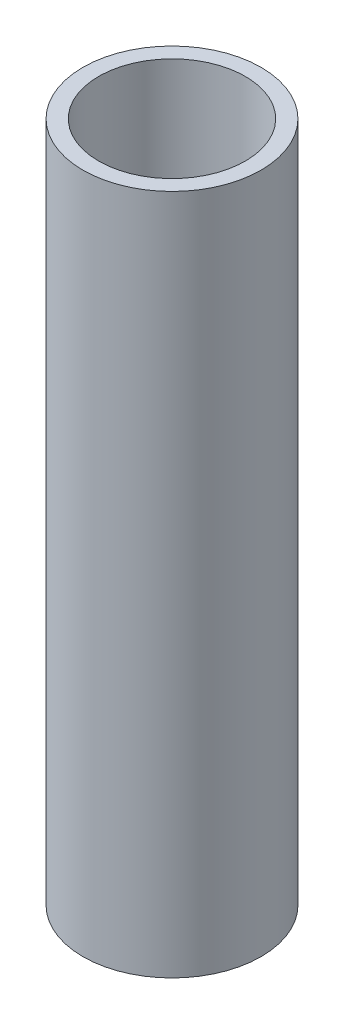
ISO-10303-21;
HEADER;
FILE_DESCRIPTION(('STEP AP214'),'2;1');
FILE_NAME('part.step','',(''),(''),'','','');
FILE_SCHEMA(('AUTOMOTIVE_DESIGN { 1 0 10303 214 1 1 1 1 }'));
ENDSEC;
DATA;
#1=APPLICATION_CONTEXT('core data for automotive mechanical design processes');
#2=APPLICATION_PROTOCOL_DEFINITION('international standard','automotive_design',2000,#1);
#3=PRODUCT_CONTEXT('',#1,'mechanical');
#4=PRODUCT('Part','Part','',(#3));
#5=PRODUCT_RELATED_PRODUCT_CATEGORY('part','',(#4));
#6=PRODUCT_DEFINITION_FORMATION('','',#4);
#7=PRODUCT_DEFINITION_CONTEXT('part definition',#1,'design');
#8=PRODUCT_DEFINITION('design','',#6,#7);
#9=PRODUCT_DEFINITION_SHAPE('','',#8);
#10=(LENGTH_UNIT() NAMED_UNIT(*) SI_UNIT(.MILLI.,.METRE.));
#11=(NAMED_UNIT(*) PLANE_ANGLE_UNIT() SI_UNIT($,.RADIAN.));
#12=(NAMED_UNIT(*) SI_UNIT($,.STERADIAN.) SOLID_ANGLE_UNIT());
#13=UNCERTAINTY_MEASURE_WITH_UNIT(LENGTH_MEASURE(1.E-05),#10,'distance_accuracy_value','');
#14=(GEOMETRIC_REPRESENTATION_CONTEXT(3) GLOBAL_UNCERTAINTY_ASSIGNED_CONTEXT((#13)) GLOBAL_UNIT_ASSIGNED_CONTEXT((#10,
#11,#12)) REPRESENTATION_CONTEXT('',''));
#15=CARTESIAN_POINT('',(0.,0.,0.));
#16=DIRECTION('',(0.,0.,1.));
#17=DIRECTION('',(1.,0.,0.));
#18=AXIS2_PLACEMENT_3D('',#15,#16,#17);
#19=CARTESIAN_POINT('',(0.,130.,0.));
#20=DIRECTION('',(0.,1.,0.));
#21=DIRECTION('',(0.,0.,1.));
#22=AXIS2_PLACEMENT_3D('',#19,#20,#21);
#23=PLANE('',#22);
#24=CARTESIAN_POINT('',(0.,130.,0.));
#25=DIRECTION('',(0.,1.,0.));
#26=DIRECTION('',(0.,0.,1.));
#27=AXIS2_PLACEMENT_3D('',#24,#25,#26);
#28=CIRCLE('',#27,17.);
#29=CARTESIAN_POINT('',(0.,130.,17.));
#30=VERTEX_POINT('',#29);
#31=EDGE_CURVE('E10',#30,#30,#28,.T.);
#32=ORIENTED_EDGE('',*,*,#31,.T.);
#33=EDGE_LOOP('',(#32));
#34=FACE_BOUND('',#33,.T.);
#35=CARTESIAN_POINT('',(0.,130.,0.));
#36=DIRECTION('',(0.,1.,0.));
#37=DIRECTION('',(0.,0.,1.));
#38=AXIS2_PLACEMENT_3D('',#35,#36,#37);
#39=CIRCLE('',#38,14.);
#40=CARTESIAN_POINT('',(0.,130.,14.));
#41=VERTEX_POINT('',#40);
#42=EDGE_CURVE('E42',#41,#41,#39,.T.);
#43=ORIENTED_EDGE('',*,*,#42,.F.);
#44=EDGE_LOOP('',(#43));
#45=FACE_BOUND('',#44,.T.);
#46=ADVANCED_FACE('F31',(#34,#45),#23,.T.);
#47=CARTESIAN_POINT('',(0.,0.,0.));
#48=DIRECTION('',(0.,1.,0.));
#49=DIRECTION('',(0.,0.,1.));
#50=AXIS2_PLACEMENT_3D('',#47,#48,#49);
#51=PLANE('',#50);
#52=CARTESIAN_POINT('',(0.,0.,0.));
#53=DIRECTION('',(0.,1.,0.));
#54=DIRECTION('',(0.,0.,1.));
#55=AXIS2_PLACEMENT_3D('',#52,#53,#54);
#56=CIRCLE('',#55,17.);
#57=CARTESIAN_POINT('',(0.,0.,17.));
#58=VERTEX_POINT('',#57);
#59=EDGE_CURVE('E35',#58,#58,#56,.T.);
#60=ORIENTED_EDGE('',*,*,#59,.F.);
#61=EDGE_LOOP('',(#60));
#62=FACE_BOUND('',#61,.T.);
#63=CARTESIAN_POINT('',(0.,0.,0.));
#64=DIRECTION('',(0.,1.,0.));
#65=DIRECTION('',(0.,0.,1.));
#66=AXIS2_PLACEMENT_3D('',#63,#64,#65);
#67=CIRCLE('',#66,14.);
#68=CARTESIAN_POINT('',(0.,0.,14.));
#69=VERTEX_POINT('',#68);
#70=EDGE_CURVE('E44',#69,#69,#67,.T.);
#71=ORIENTED_EDGE('',*,*,#70,.T.);
#72=EDGE_LOOP('',(#71));
#73=FACE_BOUND('',#72,.T.);
#74=ADVANCED_FACE('F54',(#62,#73),#51,.F.);
#75=CARTESIAN_POINT('',(0.,130.,0.));
#76=DIRECTION('',(0.,-1.,0.));
#77=DIRECTION('',(0.,0.,-1.));
#78=AXIS2_PLACEMENT_3D('',#75,#76,#77);
#79=CYLINDRICAL_SURFACE('',#78,17.);
#80=ORIENTED_EDGE('',*,*,#31,.F.);
#81=EDGE_LOOP('',(#80));
#82=FACE_BOUND('',#81,.T.);
#83=ORIENTED_EDGE('',*,*,#59,.T.);
#84=EDGE_LOOP('',(#83));
#85=FACE_BOUND('',#84,.T.);
#86=ADVANCED_FACE('F33',(#82,#85),#79,.T.);
#87=CARTESIAN_POINT('',(0.,130.,0.));
#88=DIRECTION('',(0.,-1.,0.));
#89=DIRECTION('',(0.,0.,-1.));
#90=AXIS2_PLACEMENT_3D('',#87,#88,#89);
#91=CYLINDRICAL_SURFACE('',#90,14.);
#92=ORIENTED_EDGE('',*,*,#42,.T.);
#93=EDGE_LOOP('',(#92));
#94=FACE_BOUND('',#93,.T.);
#95=ORIENTED_EDGE('',*,*,#70,.F.);
#96=EDGE_LOOP('',(#95));
#97=FACE_BOUND('',#96,.T.);
#98=ADVANCED_FACE('F50',(#94,#97),#91,.F.);
#99=CLOSED_SHELL('',(#46,#74,#86,#98));
#100=MANIFOLD_SOLID_BREP('B2',#99);
#101=ADVANCED_BREP_SHAPE_REPRESENTATION('',(#18,#100),#14);
#102=SHAPE_DEFINITION_REPRESENTATION(#9,#101);
ENDSEC;
END-ISO-10303-21;
